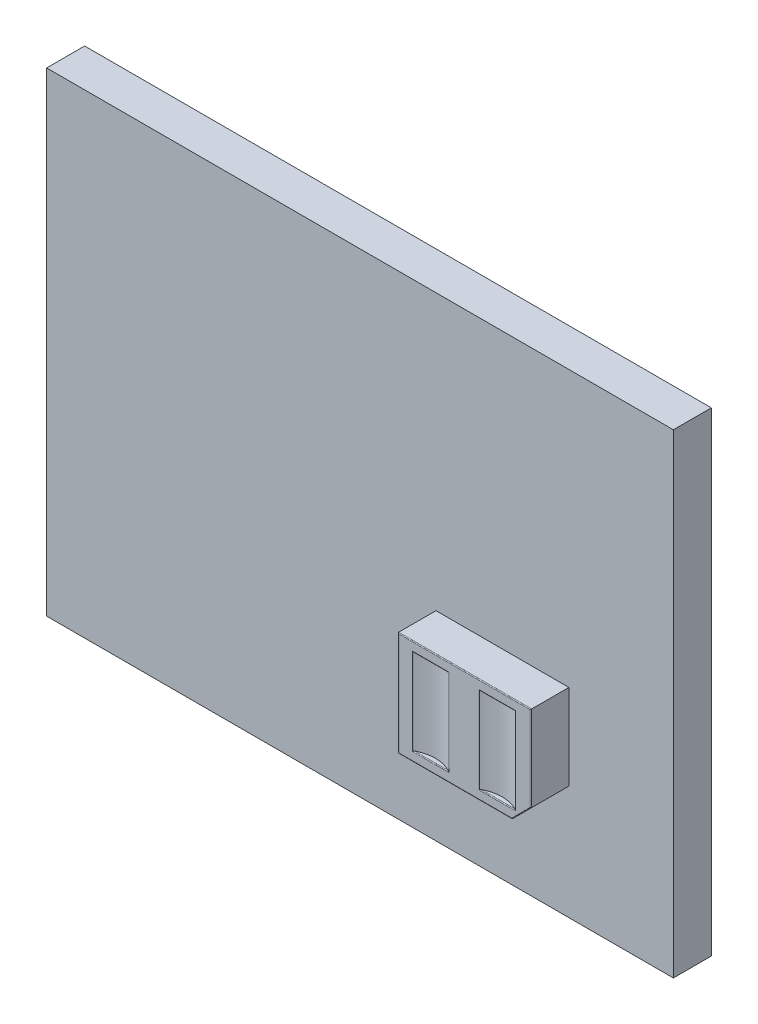
ISO-10303-21;
HEADER;
FILE_DESCRIPTION(('STEP AP214'),'2;1');
FILE_NAME('part.step','',(''),(''),'','','');
FILE_SCHEMA(('AUTOMOTIVE_DESIGN { 1 0 10303 214 1 1 1 1 }'));
ENDSEC;
DATA;
#1=APPLICATION_CONTEXT('core data for automotive mechanical design processes');
#2=APPLICATION_PROTOCOL_DEFINITION('international standard','automotive_design',2000,#1);
#3=PRODUCT_CONTEXT('',#1,'mechanical');
#4=PRODUCT('Part','Part','',(#3));
#5=PRODUCT_RELATED_PRODUCT_CATEGORY('part','',(#4));
#6=PRODUCT_DEFINITION_FORMATION('','',#4);
#7=PRODUCT_DEFINITION_CONTEXT('part definition',#1,'design');
#8=PRODUCT_DEFINITION('design','',#6,#7);
#9=PRODUCT_DEFINITION_SHAPE('','',#8);
#10=(LENGTH_UNIT() NAMED_UNIT(*) SI_UNIT(.MILLI.,.METRE.));
#11=(NAMED_UNIT(*) PLANE_ANGLE_UNIT() SI_UNIT($,.RADIAN.));
#12=(NAMED_UNIT(*) SI_UNIT($,.STERADIAN.) SOLID_ANGLE_UNIT());
#13=UNCERTAINTY_MEASURE_WITH_UNIT(LENGTH_MEASURE(1.E-05),#10,'distance_accuracy_value','');
#14=(GEOMETRIC_REPRESENTATION_CONTEXT(3) GLOBAL_UNCERTAINTY_ASSIGNED_CONTEXT((#13)) GLOBAL_UNIT_ASSIGNED_CONTEXT((#10,
#11,#12)) REPRESENTATION_CONTEXT('',''));
#15=CARTESIAN_POINT('',(0.,0.,0.));
#16=DIRECTION('',(0.,0.,1.));
#17=DIRECTION('',(1.,0.,0.));
#18=AXIS2_PLACEMENT_3D('',#15,#16,#17);
#19=CARTESIAN_POINT('',(2.,-3.75,2.));
#20=DIRECTION('',(0.,0.,1.));
#21=DIRECTION('',(1.,0.,0.));
#22=AXIS2_PLACEMENT_3D('',#19,#20,#21);
#23=PLANE('',#22);
#24=DIRECTION('',(0.,1.,0.));
#25=VECTOR('',#24,1.);
#26=CARTESIAN_POINT('',(3.34009759887177,-3.5,2.));
#27=LINE('',#26,#25);
#28=CARTESIAN_POINT('',(3.34009759887177,-1.23,2.));
#29=VERTEX_POINT('',#28);
#30=CARTESIAN_POINT('',(3.34009759887177,-3.52,2.));
#31=VERTEX_POINT('',#30);
#32=EDGE_CURVE('E281',#29,#31,#27,.F.);
#33=ORIENTED_EDGE('',*,*,#32,.T.);
#34=DIRECTION('',(-1.,0.,0.));
#35=VECTOR('',#34,1.);
#36=CARTESIAN_POINT('',(2.38457281901921,-3.52,2.));
#37=LINE('',#36,#35);
#38=CARTESIAN_POINT('',(2.37925145808885,-3.52,2.));
#39=VERTEX_POINT('',#38);
#40=EDGE_CURVE('E283',#31,#39,#37,.T.);
#41=ORIENTED_EDGE('',*,*,#40,.T.);
#42=DIRECTION('',(0.,1.,0.));
#43=VECTOR('',#42,1.);
#44=CARTESIAN_POINT('',(2.37925145808885,-1.25,2.));
#45=LINE('',#44,#43);
#46=CARTESIAN_POINT('',(2.37925145808885,-1.23,2.));
#47=VERTEX_POINT('',#46);
#48=EDGE_CURVE('E277',#39,#47,#45,.T.);
#49=ORIENTED_EDGE('',*,*,#48,.T.);
#50=DIRECTION('',(-1.,0.,0.));
#51=VECTOR('',#50,1.);
#52=CARTESIAN_POINT('',(2.,-1.23,2.));
#53=LINE('',#52,#51);
#54=EDGE_CURVE('E279',#47,#29,#53,.F.);
#55=ORIENTED_EDGE('',*,*,#54,.T.);
#56=EDGE_LOOP('',(#33,#41,#49,#55));
#57=FACE_BOUND('',#56,.T.);
#58=DIRECTION('',(0.,1.,0.));
#59=VECTOR('',#58,1.);
#60=CARTESIAN_POINT('',(5.48,-1.,2.));
#61=LINE('',#60,#59);
#62=CARTESIAN_POINT('',(5.48,-3.24171572875254,2.));
#63=VERTEX_POINT('',#62);
#64=CARTESIAN_POINT('',(5.48,-1.02,2.));
#65=VERTEX_POINT('',#64);
#66=EDGE_CURVE('E272',#63,#65,#61,.T.);
#67=ORIENTED_EDGE('',*,*,#66,.T.);
#68=DIRECTION('',(-1.,0.,0.));
#69=VECTOR('',#68,1.);
#70=CARTESIAN_POINT('',(2.,-1.02,2.));
#71=LINE('',#70,#69);
#72=CARTESIAN_POINT('',(2.02,-1.02,2.));
#73=VERTEX_POINT('',#72);
#74=EDGE_CURVE('E274',#65,#73,#71,.T.);
#75=ORIENTED_EDGE('',*,*,#74,.T.);
#76=DIRECTION('',(0.,-1.,0.));
#77=VECTOR('',#76,1.);
#78=CARTESIAN_POINT('',(2.02,-3.75,2.));
#79=LINE('',#78,#77);
#80=CARTESIAN_POINT('',(2.02,-3.73,2.));
#81=VERTEX_POINT('',#80);
#82=EDGE_CURVE('E266',#73,#81,#79,.T.);
#83=ORIENTED_EDGE('',*,*,#82,.T.);
#84=DIRECTION('',(1.,0.,0.));
#85=VECTOR('',#84,1.);
#86=CARTESIAN_POINT('',(5.,-3.73,2.));
#87=LINE('',#86,#85);
#88=CARTESIAN_POINT('',(4.99171572875254,-3.73,2.));
#89=VERTEX_POINT('',#88);
#90=EDGE_CURVE('E268',#81,#89,#87,.T.);
#91=ORIENTED_EDGE('',*,*,#90,.T.);
#92=DIRECTION('',(0.707106781186547,0.707106781186548,0.));
#93=VECTOR('',#92,1.);
#94=CARTESIAN_POINT('',(5.48585786437627,-3.23585786437627,2.));
#95=LINE('',#94,#93);
#96=EDGE_CURVE('E270',#89,#63,#95,.T.);
#97=ORIENTED_EDGE('',*,*,#96,.T.);
#98=EDGE_LOOP('',(#67,#75,#83,#91,#97));
#99=FACE_BOUND('',#98,.T.);
#100=DIRECTION('',(-1.,0.,0.));
#101=VECTOR('',#100,1.);
#102=CARTESIAN_POINT('',(2.,-3.52,2.));
#103=LINE('',#102,#101);
#104=CARTESIAN_POINT('',(5.09752708047499,-3.52,2.));
#105=VERTEX_POINT('',#104);
#106=CARTESIAN_POINT('',(4.13668093969207,-3.52,2.));
#107=VERTEX_POINT('',#106);
#108=EDGE_CURVE('E261',#105,#107,#103,.T.);
#109=ORIENTED_EDGE('',*,*,#108,.T.);
#110=DIRECTION('',(0.,1.,0.));
#111=VECTOR('',#110,1.);
#112=CARTESIAN_POINT('',(4.13668093969207,-1.25,2.));
#113=LINE('',#112,#111);
#114=CARTESIAN_POINT('',(4.13668093969207,-1.23,2.));
#115=VERTEX_POINT('',#114);
#116=EDGE_CURVE('E263',#107,#115,#113,.T.);
#117=ORIENTED_EDGE('',*,*,#116,.T.);
#118=DIRECTION('',(-1.,0.,0.));
#119=VECTOR('',#118,1.);
#120=CARTESIAN_POINT('',(5.09220571954463,-1.23,2.));
#121=LINE('',#120,#119);
#122=CARTESIAN_POINT('',(5.09752708047499,-1.23,2.));
#123=VERTEX_POINT('',#122);
#124=EDGE_CURVE('E257',#115,#123,#121,.F.);
#125=ORIENTED_EDGE('',*,*,#124,.T.);
#126=DIRECTION('',(0.,1.,0.));
#127=VECTOR('',#126,1.);
#128=CARTESIAN_POINT('',(5.09752708047499,-3.5,2.));
#129=LINE('',#128,#127);
#130=EDGE_CURVE('E259',#123,#105,#129,.F.);
#131=ORIENTED_EDGE('',*,*,#130,.T.);
#132=EDGE_LOOP('',(#109,#117,#125,#131));
#133=FACE_BOUND('',#132,.T.);
#134=ADVANCED_FACE('F33',(#57,#99,#133),#23,.T.);
#135=CARTESIAN_POINT('',(-8.25,-6.25,1.));
#136=DIRECTION('',(0.,0.,1.));
#137=DIRECTION('',(1.,0.,0.));
#138=AXIS2_PLACEMENT_3D('',#135,#136,#137);
#139=PLANE('',#138);
#140=DIRECTION('',(0.,-1.,0.));
#141=VECTOR('',#140,1.);
#142=CARTESIAN_POINT('',(-8.25,6.25,1.));
#143=LINE('',#142,#141);
#144=CARTESIAN_POINT('',(-8.25,6.25,1.));
#145=VERTEX_POINT('',#144);
#146=CARTESIAN_POINT('',(-8.25,-6.25,1.));
#147=VERTEX_POINT('',#146);
#148=EDGE_CURVE('E236',#145,#147,#143,.T.);
#149=ORIENTED_EDGE('',*,*,#148,.T.);
#150=DIRECTION('',(1.,0.,0.));
#151=VECTOR('',#150,1.);
#152=CARTESIAN_POINT('',(-8.25,-6.25,1.));
#153=LINE('',#152,#151);
#154=CARTESIAN_POINT('',(8.25,-6.25,1.));
#155=VERTEX_POINT('',#154);
#156=EDGE_CURVE('E239',#147,#155,#153,.T.);
#157=ORIENTED_EDGE('',*,*,#156,.T.);
#158=DIRECTION('',(0.,1.,0.));
#159=VECTOR('',#158,1.);
#160=CARTESIAN_POINT('',(8.25,6.25,1.));
#161=LINE('',#160,#159);
#162=CARTESIAN_POINT('',(8.25,6.25,1.));
#163=VERTEX_POINT('',#162);
#164=EDGE_CURVE('E241',#155,#163,#161,.T.);
#165=ORIENTED_EDGE('',*,*,#164,.T.);
#166=DIRECTION('',(-1.,0.,0.));
#167=VECTOR('',#166,1.);
#168=CARTESIAN_POINT('',(-8.25,6.25,1.));
#169=LINE('',#168,#167);
#170=EDGE_CURVE('E243',#163,#145,#169,.T.);
#171=ORIENTED_EDGE('',*,*,#170,.T.);
#172=EDGE_LOOP('',(#149,#157,#165,#171));
#173=FACE_BOUND('',#172,.T.);
#174=DIRECTION('',(-1.,0.,0.));
#175=VECTOR('',#174,1.);
#176=CARTESIAN_POINT('',(-8.25,-3.75,1.));
#177=LINE('',#176,#175);
#178=CARTESIAN_POINT('',(5.,-3.75,1.));
#179=VERTEX_POINT('',#178);
#180=CARTESIAN_POINT('',(2.,-3.75,1.));
#181=VERTEX_POINT('',#180);
#182=EDGE_CURVE('E221',#179,#181,#177,.T.);
#183=ORIENTED_EDGE('',*,*,#182,.T.);
#184=DIRECTION('',(0.,1.,0.));
#185=VECTOR('',#184,1.);
#186=CARTESIAN_POINT('',(2.,-6.25,1.));
#187=LINE('',#186,#185);
#188=CARTESIAN_POINT('',(2.,-1.,1.));
#189=VERTEX_POINT('',#188);
#190=EDGE_CURVE('E198',#181,#189,#187,.T.);
#191=ORIENTED_EDGE('',*,*,#190,.T.);
#192=DIRECTION('',(1.,0.,0.));
#193=VECTOR('',#192,1.);
#194=CARTESIAN_POINT('',(-8.25,-1.,1.));
#195=LINE('',#194,#193);
#196=CARTESIAN_POINT('',(5.5,-1.,1.));
#197=VERTEX_POINT('',#196);
#198=EDGE_CURVE('E209',#189,#197,#195,.T.);
#199=ORIENTED_EDGE('',*,*,#198,.T.);
#200=DIRECTION('',(0.,-1.,0.));
#201=VECTOR('',#200,1.);
#202=CARTESIAN_POINT('',(5.5,-6.25,1.));
#203=LINE('',#202,#201);
#204=CARTESIAN_POINT('',(5.5,-3.25,1.));
#205=VERTEX_POINT('',#204);
#206=EDGE_CURVE('E215',#197,#205,#203,.T.);
#207=ORIENTED_EDGE('',*,*,#206,.T.);
#208=DIRECTION('',(-0.707106781186547,-0.707106781186548,0.));
#209=VECTOR('',#208,1.);
#210=CARTESIAN_POINT('',(-2.87499999999998,-11.625,1.));
#211=LINE('',#210,#209);
#212=EDGE_CURVE('E227',#205,#179,#211,.T.);
#213=ORIENTED_EDGE('',*,*,#212,.T.);
#214=EDGE_LOOP('',(#183,#191,#199,#207,#213));
#215=FACE_BOUND('',#214,.T.);
#216=ADVANCED_FACE('F218',(#173,#215),#139,.T.);
#217=CARTESIAN_POINT('',(-8.25,6.25,1.));
#218=DIRECTION('',(1.,0.,0.));
#219=DIRECTION('',(0.,0.,-1.));
#220=AXIS2_PLACEMENT_3D('',#217,#218,#219);
#221=PLANE('',#220);
#222=DIRECTION('',(0.,-1.,0.));
#223=VECTOR('',#222,1.);
#224=CARTESIAN_POINT('',(-8.25,6.25,0.));
#225=LINE('',#224,#223);
#226=CARTESIAN_POINT('',(-8.25,6.25,0.));
#227=VERTEX_POINT('',#226);
#228=CARTESIAN_POINT('',(-8.25,-6.25,0.));
#229=VERTEX_POINT('',#228);
#230=EDGE_CURVE('E222',#227,#229,#225,.T.);
#231=ORIENTED_EDGE('',*,*,#230,.T.);
#232=DIRECTION('',(0.,0.,-1.));
#233=VECTOR('',#232,1.);
#234=CARTESIAN_POINT('',(-8.25,-6.25,1.));
#235=LINE('',#234,#233);
#236=EDGE_CURVE('E254',#147,#229,#235,.T.);
#237=ORIENTED_EDGE('',*,*,#236,.F.);
#238=ORIENTED_EDGE('',*,*,#148,.F.);
#239=DIRECTION('',(0.,0.,-1.));
#240=VECTOR('',#239,1.);
#241=CARTESIAN_POINT('',(-8.25,6.25,1.));
#242=LINE('',#241,#240);
#243=EDGE_CURVE('E245',#145,#227,#242,.T.);
#244=ORIENTED_EDGE('',*,*,#243,.T.);
#245=EDGE_LOOP('',(#231,#237,#238,#244));
#246=FACE_BOUND('',#245,.T.);
#247=ADVANCED_FACE('F35',(#246),#221,.F.);
#248=CARTESIAN_POINT('',(-8.25,-6.25,1.));
#249=DIRECTION('',(0.,1.,0.));
#250=DIRECTION('',(0.,0.,1.));
#251=AXIS2_PLACEMENT_3D('',#248,#249,#250);
#252=PLANE('',#251);
#253=DIRECTION('',(1.,0.,0.));
#254=VECTOR('',#253,1.);
#255=CARTESIAN_POINT('',(-8.25,-6.25,0.));
#256=LINE('',#255,#254);
#257=CARTESIAN_POINT('',(8.25,-6.25,0.));
#258=VERTEX_POINT('',#257);
#259=EDGE_CURVE('E225',#229,#258,#256,.T.);
#260=ORIENTED_EDGE('',*,*,#259,.T.);
#261=DIRECTION('',(0.,0.,-1.));
#262=VECTOR('',#261,1.);
#263=CARTESIAN_POINT('',(8.25,-6.25,1.));
#264=LINE('',#263,#262);
#265=EDGE_CURVE('E251',#155,#258,#264,.T.);
#266=ORIENTED_EDGE('',*,*,#265,.F.);
#267=ORIENTED_EDGE('',*,*,#156,.F.);
#268=ORIENTED_EDGE('',*,*,#236,.T.);
#269=EDGE_LOOP('',(#260,#266,#267,#268));
#270=FACE_BOUND('',#269,.T.);
#271=ADVANCED_FACE('F665',(#270),#252,.F.);
#272=CARTESIAN_POINT('',(8.25,6.25,1.));
#273=DIRECTION('',(-1.,0.,0.));
#274=DIRECTION('',(0.,0.,1.));
#275=AXIS2_PLACEMENT_3D('',#272,#273,#274);
#276=PLANE('',#275);
#277=DIRECTION('',(0.,1.,0.));
#278=VECTOR('',#277,1.);
#279=CARTESIAN_POINT('',(8.25,6.25,0.));
#280=LINE('',#279,#278);
#281=CARTESIAN_POINT('',(8.25,6.25,0.));
#282=VERTEX_POINT('',#281);
#283=EDGE_CURVE('E232',#258,#282,#280,.T.);
#284=ORIENTED_EDGE('',*,*,#283,.T.);
#285=DIRECTION('',(0.,0.,-1.));
#286=VECTOR('',#285,1.);
#287=CARTESIAN_POINT('',(8.25,6.25,1.));
#288=LINE('',#287,#286);
#289=EDGE_CURVE('E248',#163,#282,#288,.T.);
#290=ORIENTED_EDGE('',*,*,#289,.F.);
#291=ORIENTED_EDGE('',*,*,#164,.F.);
#292=ORIENTED_EDGE('',*,*,#265,.T.);
#293=EDGE_LOOP('',(#284,#290,#291,#292));
#294=FACE_BOUND('',#293,.T.);
#295=ADVANCED_FACE('F655',(#294),#276,.F.);
#296=CARTESIAN_POINT('',(-8.25,6.25,1.));
#297=DIRECTION('',(0.,-1.,0.));
#298=DIRECTION('',(0.,0.,-1.));
#299=AXIS2_PLACEMENT_3D('',#296,#297,#298);
#300=PLANE('',#299);
#301=DIRECTION('',(-1.,0.,0.));
#302=VECTOR('',#301,1.);
#303=CARTESIAN_POINT('',(-8.25,6.25,0.));
#304=LINE('',#303,#302);
#305=EDGE_CURVE('E234',#282,#227,#304,.T.);
#306=ORIENTED_EDGE('',*,*,#305,.T.);
#307=ORIENTED_EDGE('',*,*,#243,.F.);
#308=ORIENTED_EDGE('',*,*,#170,.F.);
#309=ORIENTED_EDGE('',*,*,#289,.T.);
#310=EDGE_LOOP('',(#306,#307,#308,#309));
#311=FACE_BOUND('',#310,.T.);
#312=ADVANCED_FACE('F637',(#311),#300,.F.);
#313=CARTESIAN_POINT('',(-8.25,-6.25,0.));
#314=DIRECTION('',(0.,0.,1.));
#315=DIRECTION('',(1.,0.,0.));
#316=AXIS2_PLACEMENT_3D('',#313,#314,#315);
#317=PLANE('',#316);
#318=ORIENTED_EDGE('',*,*,#230,.F.);
#319=ORIENTED_EDGE('',*,*,#305,.F.);
#320=ORIENTED_EDGE('',*,*,#283,.F.);
#321=ORIENTED_EDGE('',*,*,#259,.F.);
#322=EDGE_LOOP('',(#318,#319,#320,#321));
#323=FACE_BOUND('',#322,.T.);
#324=ADVANCED_FACE('F621',(#323),#317,.F.);
#325=CARTESIAN_POINT('',(2.,-3.75,2.));
#326=DIRECTION('',(1.,0.,0.));
#327=DIRECTION('',(0.,1.,0.));
#328=AXIS2_PLACEMENT_3D('',#325,#326,#327);
#329=PLANE('',#328);
#330=DIRECTION('',(0.,0.,-1.));
#331=VECTOR('',#330,1.);
#332=CARTESIAN_POINT('',(2.,-3.75,2.));
#333=LINE('',#332,#331);
#334=CARTESIAN_POINT('',(2.,-3.75,1.98));
#335=VERTEX_POINT('',#334);
#336=EDGE_CURVE('E216',#335,#181,#333,.T.);
#337=ORIENTED_EDGE('',*,*,#336,.F.);
#338=DIRECTION('',(0.,-1.,0.));
#339=VECTOR('',#338,1.);
#340=CARTESIAN_POINT('',(2.,-1.,1.98));
#341=LINE('',#340,#339);
#342=CARTESIAN_POINT('',(2.,-1.,1.98));
#343=VERTEX_POINT('',#342);
#344=EDGE_CURVE('E201',#335,#343,#341,.F.);
#345=ORIENTED_EDGE('',*,*,#344,.T.);
#346=DIRECTION('',(0.,0.,-1.));
#347=VECTOR('',#346,1.);
#348=CARTESIAN_POINT('',(2.,-1.,2.));
#349=LINE('',#348,#347);
#350=EDGE_CURVE('E193',#343,#189,#349,.T.);
#351=ORIENTED_EDGE('',*,*,#350,.T.);
#352=ORIENTED_EDGE('',*,*,#190,.F.);
#353=EDGE_LOOP('',(#337,#345,#351,#352));
#354=FACE_BOUND('',#353,.T.);
#355=ADVANCED_FACE('F196',(#354),#329,.F.);
#356=CARTESIAN_POINT('',(5.,-3.75,2.));
#357=DIRECTION('',(0.,1.,0.));
#358=DIRECTION('',(-1.,0.,0.));
#359=AXIS2_PLACEMENT_3D('',#356,#357,#358);
#360=PLANE('',#359);
#361=DIRECTION('',(0.,0.,-1.));
#362=VECTOR('',#361,1.);
#363=CARTESIAN_POINT('',(5.,-3.75,2.));
#364=LINE('',#363,#362);
#365=CARTESIAN_POINT('',(5.,-3.75,1.98));
#366=VERTEX_POINT('',#365);
#367=EDGE_CURVE('E452',#366,#179,#364,.T.);
#368=ORIENTED_EDGE('',*,*,#367,.F.);
#369=DIRECTION('',(1.,0.,0.));
#370=VECTOR('',#369,1.);
#371=CARTESIAN_POINT('',(2.,-3.75,1.98));
#372=LINE('',#371,#370);
#373=EDGE_CURVE('E301',#366,#335,#372,.F.);
#374=ORIENTED_EDGE('',*,*,#373,.T.);
#375=ORIENTED_EDGE('',*,*,#336,.T.);
#376=ORIENTED_EDGE('',*,*,#182,.F.);
#377=EDGE_LOOP('',(#368,#374,#375,#376));
#378=FACE_BOUND('',#377,.T.);
#379=ADVANCED_FACE('F463',(#378),#360,.F.);
#380=CARTESIAN_POINT('',(5.5,-3.25,2.));
#381=DIRECTION('',(-0.707106781186548,0.707106781186547,0.));
#382=DIRECTION('',(-0.707106781186547,-0.707106781186548,0.));
#383=AXIS2_PLACEMENT_3D('',#380,#381,#382);
#384=PLANE('',#383);
#385=DIRECTION('',(0.,0.,-1.));
#386=VECTOR('',#385,1.);
#387=CARTESIAN_POINT('',(5.5,-3.25,2.));
#388=LINE('',#387,#386);
#389=CARTESIAN_POINT('',(5.5,-3.25,1.98));
#390=VERTEX_POINT('',#389);
#391=EDGE_CURVE('E450',#390,#205,#388,.T.);
#392=ORIENTED_EDGE('',*,*,#391,.F.);
#393=DIRECTION('',(0.707106781186547,0.707106781186548,0.));
#394=VECTOR('',#393,1.);
#395=CARTESIAN_POINT('',(5.,-3.75,1.98));
#396=LINE('',#395,#394);
#397=EDGE_CURVE('E299',#390,#366,#396,.F.);
#398=ORIENTED_EDGE('',*,*,#397,.T.);
#399=ORIENTED_EDGE('',*,*,#367,.T.);
#400=ORIENTED_EDGE('',*,*,#212,.F.);
#401=EDGE_LOOP('',(#392,#398,#399,#400));
#402=FACE_BOUND('',#401,.T.);
#403=ADVANCED_FACE('F458',(#402),#384,.F.);
#404=CARTESIAN_POINT('',(5.5,-1.,2.));
#405=DIRECTION('',(-1.,0.,0.));
#406=DIRECTION('',(0.,0.,1.));
#407=AXIS2_PLACEMENT_3D('',#404,#405,#406);
#408=PLANE('',#407);
#409=DIRECTION('',(0.,0.,-1.));
#410=VECTOR('',#409,1.);
#411=CARTESIAN_POINT('',(5.5,-1.,2.));
#412=LINE('',#411,#410);
#413=CARTESIAN_POINT('',(5.5,-1.,1.98));
#414=VERTEX_POINT('',#413);
#415=EDGE_CURVE('E205',#414,#197,#412,.T.);
#416=ORIENTED_EDGE('',*,*,#415,.F.);
#417=DIRECTION('',(0.,1.,0.));
#418=VECTOR('',#417,1.);
#419=CARTESIAN_POINT('',(5.5,-3.25,1.98));
#420=LINE('',#419,#418);
#421=EDGE_CURVE('E297',#414,#390,#420,.F.);
#422=ORIENTED_EDGE('',*,*,#421,.T.);
#423=ORIENTED_EDGE('',*,*,#391,.T.);
#424=ORIENTED_EDGE('',*,*,#206,.F.);
#425=EDGE_LOOP('',(#416,#422,#423,#424));
#426=FACE_BOUND('',#425,.T.);
#427=ADVANCED_FACE('F479',(#426),#408,.F.);
#428=CARTESIAN_POINT('',(2.,-1.,2.));
#429=DIRECTION('',(0.,-1.,0.));
#430=DIRECTION('',(0.,0.,-1.));
#431=AXIS2_PLACEMENT_3D('',#428,#429,#430);
#432=PLANE('',#431);
#433=ORIENTED_EDGE('',*,*,#350,.F.);
#434=DIRECTION('',(-1.,0.,0.));
#435=VECTOR('',#434,1.);
#436=CARTESIAN_POINT('',(5.5,-1.,1.98));
#437=LINE('',#436,#435);
#438=EDGE_CURVE('E295',#343,#414,#437,.F.);
#439=ORIENTED_EDGE('',*,*,#438,.T.);
#440=ORIENTED_EDGE('',*,*,#415,.T.);
#441=ORIENTED_EDGE('',*,*,#198,.F.);
#442=EDGE_LOOP('',(#433,#439,#440,#441));
#443=FACE_BOUND('',#442,.T.);
#444=ADVANCED_FACE('F210',(#443),#432,.F.);
#445=CARTESIAN_POINT('',(2.85967452848031,-1.25,2.82428912257081));
#446=DIRECTION('',(0.,-1.,0.));
#447=DIRECTION('',(0.,0.,-1.));
#448=AXIS2_PLACEMENT_3D('',#445,#446,#447);
#449=CYLINDRICAL_SURFACE('',#448,0.95140642835826);
#450=CARTESIAN_POINT('',(3.29825185282578,-3.5,1.98));
#451=CARTESIAN_POINT('',(3.30030143263974,-3.50000121839168,1.98106471582591));
#452=CARTESIAN_POINT('',(3.30234482766277,-3.50008460776287,1.98213566956922));
#453=CARTESIAN_POINT('',(3.30642373641544,-3.5004352465639,1.9842922526646));
#454=CARTESIAN_POINT('',(3.30845912580693,-3.50070361570461,1.98537793169879));
#455=CARTESIAN_POINT('',(3.31432945041123,-3.5017791143004,1.98853680792534));
#456=CARTESIAN_POINT('',(3.31812678666193,-3.50285399691591,1.99061495007289));
#457=CARTESIAN_POINT('',(3.32324263650945,-3.50516501582656,1.99345711157462));
#458=CARTESIAN_POINT('',(3.32472361069494,-3.50594762114878,1.99428546911798));
#459=CARTESIAN_POINT('',(3.3275757839046,-3.50779498116049,1.99588979719535));
#460=CARTESIAN_POINT('',(3.32894432307832,-3.50886487402507,1.99666445338982));
#461=CARTESIAN_POINT('',(3.33020631019211,-3.51010871132026,1.9973828193414));
#462=B_SPLINE_CURVE_WITH_KNOTS('',3,(#450,#451,#452,#453,#454,#455,#456,#457,#458,#459,#460,
#461),.UNSPECIFIED.,.F.,.F.,(4,2,2,2,2,4),(0.,0.00692143937361541,0.0138851475056122,
0.027147880605819,0.0327331858915279,0.0384259374750013),.UNSPECIFIED.);
#463=CARTESIAN_POINT('',(3.29825185282578,-3.5,1.98));
#464=VERTEX_POINT('',#463);
#465=CARTESIAN_POINT('',(3.33020631019246,-3.51010871131924,1.9973828193416));
#466=VERTEX_POINT('',#465);
#467=EDGE_CURVE('E318',#464,#466,#462,.T.);
#468=ORIENTED_EDGE('',*,*,#467,.T.);
#469=DIRECTION('',(0.,-1.,0.));
#470=VECTOR('',#469,1.);
#471=CARTESIAN_POINT('',(3.33020631019246,-1.25,1.9973828193416));
#472=LINE('',#471,#470);
#473=CARTESIAN_POINT('',(3.33020631019246,-1.23989128868076,1.9973828193416));
#474=VERTEX_POINT('',#473);
#475=EDGE_CURVE('E291',#466,#474,#472,.F.);
#476=ORIENTED_EDGE('',*,*,#475,.T.);
#477=CARTESIAN_POINT('',(3.33020631019246,-1.23989128868076,1.9973828193416));
#478=CARTESIAN_POINT('',(3.32907457056046,-1.24101003683441,1.99673862227858));
#479=CARTESIAN_POINT('',(3.32785338435945,-1.24198753053109,1.99604700264423));
#480=CARTESIAN_POINT('',(3.32530170338301,-1.24370587720741,1.99460993356394));
#481=CARTESIAN_POINT('',(3.32397241183,-1.24444897937049,1.99386508551638));
#482=CARTESIAN_POINT('',(3.32006330504253,-1.24633742044261,1.99168783877315));
#483=CARTESIAN_POINT('',(3.31740293921396,-1.24726919187549,1.99022177053134));
#484=CARTESIAN_POINT('',(3.31196357324895,-1.24870863437455,1.98725952948016));
#485=CARTESIAN_POINT('',(3.30918374060652,-1.24921253457698,1.98576320561733));
#486=CARTESIAN_POINT('',(3.30502790468668,-1.24969551509605,1.98355318171556));
#487=CARTESIAN_POINT('',(3.3036687385853,-1.24981123923966,1.98283460719886));
#488=CARTESIAN_POINT('',(3.30095755661327,-1.24996295288859,1.98140965105981));
#489=CARTESIAN_POINT('',(3.29960561255512,-1.24999975606144,1.98070322024471));
#490=CARTESIAN_POINT('',(3.29825185282578,-1.25,1.98));
#491=B_SPLINE_CURVE_WITH_KNOTS('',3,(#477,#478,#479,#480,#481,#482,#483,#484,#485,#486,#487,
#488,#489,#490),.UNSPECIFIED.,.F.,.F.,(4,2,2,2,2,2,4),(0.,0.00511946838208151,
0.0101882011420187,0.0196727538814233,0.0292400519423795,0.033863671938869,0.038439389001407),.UNSPECIFIED.);
#492=CARTESIAN_POINT('',(3.29825185282578,-1.25,1.98));
#493=VERTEX_POINT('',#492);
#494=EDGE_CURVE('E357',#474,#493,#491,.T.);
#495=ORIENTED_EDGE('',*,*,#494,.T.);
#496=CARTESIAN_POINT('',(2.85967452848031,-1.25,2.82428912257081));
#497=DIRECTION('',(0.,-1.,0.));
#498=DIRECTION('',(0.,0.,-1.));
#499=AXIS2_PLACEMENT_3D('',#496,#497,#498);
#500=CIRCLE('',#499,0.95140642835826);
#501=CARTESIAN_POINT('',(2.42109720413484,-1.25,1.98));
#502=VERTEX_POINT('',#501);
#503=EDGE_CURVE('E206',#502,#493,#500,.T.);
#504=ORIENTED_EDGE('',*,*,#503,.F.);
#505=CARTESIAN_POINT('',(2.42109720413517,-1.25,1.97999999999983));
#506=CARTESIAN_POINT('',(2.41904762432119,-1.24999878160833,1.98106471582575));
#507=CARTESIAN_POINT('',(2.41700422929815,-1.24991539223715,1.98213566956907));
#508=CARTESIAN_POINT('',(2.41292532054544,-1.24956475343614,1.98429225266446));
#509=CARTESIAN_POINT('',(2.41088993115393,-1.24929638429543,1.98537793169866));
#510=CARTESIAN_POINT('',(2.40501960654959,-1.24822088569966,1.98853680792524));
#511=CARTESIAN_POINT('',(2.40122227029885,-1.24714600308415,1.9906149500728));
#512=CARTESIAN_POINT('',(2.39610642045128,-1.2448349841735,1.99345711157455));
#513=CARTESIAN_POINT('',(2.39462544626576,-1.24405237885127,1.99428546911793));
#514=CARTESIAN_POINT('',(2.39177327305606,-1.24220501883954,1.99588979719533));
#515=CARTESIAN_POINT('',(2.39040473388232,-1.24113512597495,1.99666445338981));
#516=CARTESIAN_POINT('',(2.38914274676851,-1.23989128867974,1.9973828193414));
#517=B_SPLINE_CURVE_WITH_KNOTS('',3,(#505,#506,#507,#508,#509,#510,#511,#512,#513,#514,#515,
#516),.UNSPECIFIED.,.F.,.F.,(4,2,2,2,2,4),(0.,0.00692143937366663,0.0138851475057146,
0.0271478806060176,0.0327331858918071,0.0384259374753652),.UNSPECIFIED.);
#518=CARTESIAN_POINT('',(2.38914274676816,-1.23989128868076,1.9973828193416));
#519=VERTEX_POINT('',#518);
#520=EDGE_CURVE('E352',#502,#519,#517,.T.);
#521=ORIENTED_EDGE('',*,*,#520,.T.);
#522=DIRECTION('',(0.,-1.,0.));
#523=VECTOR('',#522,1.);
#524=CARTESIAN_POINT('',(2.38914274676816,-1.25,1.9973828193416));
#525=LINE('',#524,#523);
#526=CARTESIAN_POINT('',(2.38914274676816,-3.51010871131924,1.9973828193416));
#527=VERTEX_POINT('',#526);
#528=EDGE_CURVE('E289',#519,#527,#525,.T.);
#529=ORIENTED_EDGE('',*,*,#528,.T.);
#530=CARTESIAN_POINT('',(2.38914274676816,-3.51010871131924,1.9973828193416));
#531=CARTESIAN_POINT('',(2.39027448640016,-3.5089899631656,1.99673862227858));
#532=CARTESIAN_POINT('',(2.39149567260117,-3.50801246946891,1.99604700264423));
#533=CARTESIAN_POINT('',(2.39404735357761,-3.50629412279259,1.99460993356394));
#534=CARTESIAN_POINT('',(2.39537664513062,-3.50555102062951,1.99386508551638));
#535=CARTESIAN_POINT('',(2.39928575191809,-3.50366257955739,1.99168783877315));
#536=CARTESIAN_POINT('',(2.40194611774665,-3.50273080812452,1.99022177053134));
#537=CARTESIAN_POINT('',(2.40738548371167,-3.50129136562545,1.98725952948016));
#538=CARTESIAN_POINT('',(2.4101653163541,-3.50078746542302,1.98576320561733));
#539=CARTESIAN_POINT('',(2.41432115227413,-3.50030448490393,1.98355318171546));
#540=CARTESIAN_POINT('',(2.41568031837571,-3.50018876076031,1.98283460719865));
#541=CARTESIAN_POINT('',(2.41839150034813,-3.50003704711138,1.98140965105941));
#542=CARTESIAN_POINT('',(2.41974344440647,-3.50000024393855,1.9807032202442));
#543=CARTESIAN_POINT('',(2.42109720413601,-3.5,1.9799999999994));
#544=B_SPLINE_CURVE_WITH_KNOTS('',3,(#530,#531,#532,#533,#534,#535,#536,#537,#538,#539,#540,
#541,#542,#543),.UNSPECIFIED.,.F.,.F.,(4,2,2,2,2,2,4),(0.,0.00511946838208176,
0.0101882011420185,0.0196727538814203,0.0292400519423793,0.0338636719395309,0.0384393890027168),.UNSPECIFIED.);
#545=CARTESIAN_POINT('',(2.42109720413484,-3.5,1.98));
#546=VERTEX_POINT('',#545);
#547=EDGE_CURVE('E311',#527,#546,#544,.T.);
#548=ORIENTED_EDGE('',*,*,#547,.T.);
#549=CARTESIAN_POINT('',(2.85967452848031,-3.5,2.82428912257081));
#550=DIRECTION('',(0.,-1.,0.));
#551=DIRECTION('',(0.,0.,-1.));
#552=AXIS2_PLACEMENT_3D('',#549,#550,#551);
#553=CIRCLE('',#552,0.95140642835826);
#554=EDGE_CURVE('E444',#546,#464,#553,.T.);
#555=ORIENTED_EDGE('',*,*,#554,.T.);
#556=EDGE_LOOP('',(#468,#476,#495,#504,#521,#529,#548,#555));
#557=FACE_BOUND('',#556,.T.);
#558=ADVANCED_FACE('F323',(#557),#449,.F.);
#559=CARTESIAN_POINT('',(2.85967452848031,-1.25,2.82428912257081));
#560=DIRECTION('',(0.,-1.,0.));
#561=DIRECTION('',(0.,0.,-1.));
#562=AXIS2_PLACEMENT_3D('',#559,#560,#561);
#563=PLANE('',#562);
#564=ORIENTED_EDGE('',*,*,#503,.T.);
#565=DIRECTION('',(-1.,0.,0.));
#566=VECTOR('',#565,1.);
#567=CARTESIAN_POINT('',(2.85967452848031,-1.25,1.98));
#568=LINE('',#567,#566);
#569=EDGE_CURVE('E293',#493,#502,#568,.T.);
#570=ORIENTED_EDGE('',*,*,#569,.T.);
#571=EDGE_LOOP('',(#564,#570));
#572=FACE_BOUND('',#571,.T.);
#573=ADVANCED_FACE('F563',(#572),#563,.T.);
#574=CARTESIAN_POINT('',(2.85967452848031,-3.5,2.82428912257081));
#575=DIRECTION('',(0.,-1.,0.));
#576=DIRECTION('',(0.,0.,-1.));
#577=AXIS2_PLACEMENT_3D('',#574,#575,#576);
#578=PLANE('',#577);
#579=ORIENTED_EDGE('',*,*,#554,.F.);
#580=DIRECTION('',(-1.,0.,0.));
#581=VECTOR('',#580,1.);
#582=CARTESIAN_POINT('',(3.33477623794141,-3.5,1.98));
#583=LINE('',#582,#581);
#584=EDGE_CURVE('E286',#546,#464,#583,.F.);
#585=ORIENTED_EDGE('',*,*,#584,.T.);
#586=EDGE_LOOP('',(#579,#585));
#587=FACE_BOUND('',#586,.T.);
#588=ADVANCED_FACE('F505',(#587),#578,.F.);
#589=CARTESIAN_POINT('',(4.61710401008353,-1.25,2.82428912257081));
#590=DIRECTION('',(0.,-1.,0.));
#591=DIRECTION('',(0.,0.,-1.));
#592=AXIS2_PLACEMENT_3D('',#589,#590,#591);
#593=CYLINDRICAL_SURFACE('',#592,0.95140642835826);
#594=CARTESIAN_POINT('',(4.61710401008353,-1.25,2.82428912257081));
#595=DIRECTION('',(0.,-1.,0.));
#596=DIRECTION('',(0.,0.,1.));
#597=AXIS2_PLACEMENT_3D('',#594,#595,#596);
#598=CIRCLE('',#597,0.95140642835826);
#599=CARTESIAN_POINT('',(4.17852668573806,-1.25,1.98));
#600=VERTEX_POINT('',#599);
#601=CARTESIAN_POINT('',(5.05568133442899,-1.25,1.98));
#602=VERTEX_POINT('',#601);
#603=EDGE_CURVE('E441',#600,#602,#598,.T.);
#604=ORIENTED_EDGE('',*,*,#603,.F.);
#605=CARTESIAN_POINT('',(4.17852668573838,-1.25,1.97999999999983));
#606=CARTESIAN_POINT('',(4.17647710592441,-1.24999878160833,1.98106471582575));
#607=CARTESIAN_POINT('',(4.17443371090136,-1.24991539223715,1.98213566956907));
#608=CARTESIAN_POINT('',(4.17035480214865,-1.24956475343614,1.98429225266446));
#609=CARTESIAN_POINT('',(4.16831941275715,-1.24929638429543,1.98537793169867));
#610=CARTESIAN_POINT('',(4.16244908815281,-1.24822088569966,1.98853680792524));
#611=CARTESIAN_POINT('',(4.15865175190207,-1.24714600308415,1.9906149500728));
#612=CARTESIAN_POINT('',(4.1535359020545,-1.2448349841735,1.99345711157455));
#613=CARTESIAN_POINT('',(4.15205492786898,-1.24405237885127,1.99428546911793));
#614=CARTESIAN_POINT('',(4.14920275465927,-1.24220501883954,1.99588979719533));
#615=CARTESIAN_POINT('',(4.14783421548553,-1.24113512597495,1.99666445338981));
#616=CARTESIAN_POINT('',(4.14657222837173,-1.23989128867974,1.9973828193414));
#617=B_SPLINE_CURVE_WITH_KNOTS('',3,(#605,#606,#607,#608,#609,#610,#611,#612,#613,#614,#615,
#616),.UNSPECIFIED.,.F.,.F.,(4,2,2,2,2,4),(0.,0.00692143937366643,0.0138851475057154,
0.0271478806060181,0.0327331858918068,0.038425937475364),.UNSPECIFIED.);
#618=CARTESIAN_POINT('',(4.14657222837138,-1.23989128868076,1.9973828193416));
#619=VERTEX_POINT('',#618);
#620=EDGE_CURVE('E46',#600,#619,#617,.T.);
#621=ORIENTED_EDGE('',*,*,#620,.T.);
#622=DIRECTION('',(0.,-1.,0.));
#623=VECTOR('',#622,1.);
#624=CARTESIAN_POINT('',(4.14657222837138,-1.25,1.9973828193416));
#625=LINE('',#624,#623);
#626=CARTESIAN_POINT('',(4.14657222837138,-3.51010871131924,1.9973828193416));
#627=VERTEX_POINT('',#626);
#628=EDGE_CURVE('E305',#619,#627,#625,.T.);
#629=ORIENTED_EDGE('',*,*,#628,.T.);
#630=CARTESIAN_POINT('',(4.14657222837138,-3.51010871131924,1.9973828193416));
#631=CARTESIAN_POINT('',(4.14770396800338,-3.5089899631656,1.99673862227858));
#632=CARTESIAN_POINT('',(4.14892515420438,-3.50801246946891,1.99604700264423));
#633=CARTESIAN_POINT('',(4.15147683518083,-3.50629412279259,1.99460993356394));
#634=CARTESIAN_POINT('',(4.15280612673384,-3.50555102062951,1.99386508551638));
#635=CARTESIAN_POINT('',(4.15671523352131,-3.50366257955739,1.99168783877315));
#636=CARTESIAN_POINT('',(4.15937559934987,-3.50273080812452,1.99022177053134));
#637=CARTESIAN_POINT('',(4.16481496531489,-3.50129136562545,1.98725952948016));
#638=CARTESIAN_POINT('',(4.16759479795732,-3.50078746542302,1.98576320561733));
#639=CARTESIAN_POINT('',(4.17175063387735,-3.50030448490393,1.98355318171546));
#640=CARTESIAN_POINT('',(4.17310979997893,-3.50018876076031,1.98283460719865));
#641=CARTESIAN_POINT('',(4.17582098195135,-3.50003704711138,1.98140965105941));
#642=CARTESIAN_POINT('',(4.17717292600969,-3.50000024393855,1.9807032202442));
#643=CARTESIAN_POINT('',(4.17852668573922,-3.5,1.9799999999994));
#644=B_SPLINE_CURVE_WITH_KNOTS('',3,(#630,#631,#632,#633,#634,#635,#636,#637,#638,#639,#640,
#641,#642,#643),.UNSPECIFIED.,.F.,.F.,(4,2,2,2,2,2,4),(0.,0.00511946838208199,
0.0101882011420187,0.0196727538814197,0.0292400519423791,0.0338636719395303,0.0384393890027168),.UNSPECIFIED.);
#645=CARTESIAN_POINT('',(4.17852668573806,-3.5,1.98));
#646=VERTEX_POINT('',#645);
#647=EDGE_CURVE('E362',#627,#646,#644,.T.);
#648=ORIENTED_EDGE('',*,*,#647,.T.);
#649=CARTESIAN_POINT('',(4.61710401008353,-3.5,2.82428912257081));
#650=DIRECTION('',(0.,-1.,0.));
#651=DIRECTION('',(0.,0.,1.));
#652=AXIS2_PLACEMENT_3D('',#649,#650,#651);
#653=CIRCLE('',#652,0.95140642835826);
#654=CARTESIAN_POINT('',(5.05568133442899,-3.5,1.98));
#655=VERTEX_POINT('',#654);
#656=EDGE_CURVE('E401',#646,#655,#653,.T.);
#657=ORIENTED_EDGE('',*,*,#656,.T.);
#658=CARTESIAN_POINT('',(5.05568133442899,-3.5,1.98));
#659=CARTESIAN_POINT('',(5.05773091424295,-3.50000121839168,1.98106471582591));
#660=CARTESIAN_POINT('',(5.05977430926598,-3.50008460776287,1.98213566956922));
#661=CARTESIAN_POINT('',(5.06385321801866,-3.5004352465639,1.9842922526646));
#662=CARTESIAN_POINT('',(5.06588860741015,-3.50070361570461,1.9853779316988));
#663=CARTESIAN_POINT('',(5.07175893201444,-3.5017791143004,1.98853680792534));
#664=CARTESIAN_POINT('',(5.07555626826515,-3.50285399691591,1.99061495007289));
#665=CARTESIAN_POINT('',(5.08067211811266,-3.50516501582656,1.99345711157462));
#666=CARTESIAN_POINT('',(5.08215309229816,-3.50594762114878,1.99428546911798));
#667=CARTESIAN_POINT('',(5.08500526550782,-3.50779498116049,1.99588979719535));
#668=CARTESIAN_POINT('',(5.08637380468154,-3.50886487402507,1.99666445338982));
#669=CARTESIAN_POINT('',(5.08763579179533,-3.51010871132026,1.9973828193414));
#670=B_SPLINE_CURVE_WITH_KNOTS('',3,(#658,#659,#660,#661,#662,#663,#664,#665,#666,#667,#668,
#669),.UNSPECIFIED.,.F.,.F.,(4,2,2,2,2,4),(0.,0.00692143937361483,0.0138851475056124,
0.0271478806058188,0.0327331858915274,0.038425937475001),.UNSPECIFIED.);
#671=CARTESIAN_POINT('',(5.08763579179568,-3.51010871131924,1.9973828193416));
#672=VERTEX_POINT('',#671);
#673=EDGE_CURVE('E368',#655,#672,#670,.T.);
#674=ORIENTED_EDGE('',*,*,#673,.T.);
#675=DIRECTION('',(0.,-1.,0.));
#676=VECTOR('',#675,1.);
#677=CARTESIAN_POINT('',(5.08763579179568,-1.25,1.9973828193416));
#678=LINE('',#677,#676);
#679=CARTESIAN_POINT('',(5.08763579179568,-1.23989128868076,1.9973828193416));
#680=VERTEX_POINT('',#679);
#681=EDGE_CURVE('E52',#672,#680,#678,.F.);
#682=ORIENTED_EDGE('',*,*,#681,.T.);
#683=CARTESIAN_POINT('',(5.08763579179568,-1.23989128868076,1.9973828193416));
#684=CARTESIAN_POINT('',(5.08650405216367,-1.24101003683441,1.99673862227858));
#685=CARTESIAN_POINT('',(5.08528286596267,-1.24198753053109,1.99604700264423));
#686=CARTESIAN_POINT('',(5.08273118498623,-1.24370587720741,1.99460993356394));
#687=CARTESIAN_POINT('',(5.08140189343322,-1.24444897937049,1.99386508551638));
#688=CARTESIAN_POINT('',(5.07749278664574,-1.24633742044261,1.99168783877315));
#689=CARTESIAN_POINT('',(5.07483242081718,-1.24726919187549,1.99022177053134));
#690=CARTESIAN_POINT('',(5.06939305485216,-1.24870863437455,1.98725952948016));
#691=CARTESIAN_POINT('',(5.06661322220973,-1.24921253457698,1.98576320561733));
#692=CARTESIAN_POINT('',(5.0624573862899,-1.24969551509605,1.98355318171556));
#693=CARTESIAN_POINT('',(5.06109822018852,-1.24981123923966,1.98283460719886));
#694=CARTESIAN_POINT('',(5.05838703821648,-1.24996295288859,1.98140965105981));
#695=CARTESIAN_POINT('',(5.05703509415834,-1.24999975606144,1.98070322024471));
#696=CARTESIAN_POINT('',(5.05568133442899,-1.25,1.98));
#697=B_SPLINE_CURVE_WITH_KNOTS('',3,(#683,#684,#685,#686,#687,#688,#689,#690,#691,#692,#693,
#694,#695,#696),.UNSPECIFIED.,.F.,.F.,(4,2,2,2,2,2,4),(0.,0.00511946838208138,
0.0101882011420187,0.0196727538814229,0.0292400519423781,0.0338636719388692,0.0384393890014075),.UNSPECIFIED.);
#698=EDGE_CURVE('E11',#680,#602,#697,.T.);
#699=ORIENTED_EDGE('',*,*,#698,.T.);
#700=EDGE_LOOP('',(#604,#621,#629,#648,#657,#674,#682,#699));
#701=FACE_BOUND('',#700,.T.);
#702=ADVANCED_FACE('F372',(#701),#593,.F.);
#703=CARTESIAN_POINT('',(4.61710401008353,-1.25,2.82428912257081));
#704=DIRECTION('',(0.,1.,0.));
#705=DIRECTION('',(0.,0.,1.));
#706=AXIS2_PLACEMENT_3D('',#703,#704,#705);
#707=PLANE('',#706);
#708=ORIENTED_EDGE('',*,*,#603,.T.);
#709=DIRECTION('',(-1.,0.,0.));
#710=VECTOR('',#709,1.);
#711=CARTESIAN_POINT('',(4.14200230062243,-1.25,1.98));
#712=LINE('',#711,#710);
#713=EDGE_CURVE('E309',#602,#600,#712,.T.);
#714=ORIENTED_EDGE('',*,*,#713,.T.);
#715=EDGE_LOOP('',(#708,#714));
#716=FACE_BOUND('',#715,.T.);
#717=ADVANCED_FACE('F497',(#716),#707,.F.);
#718=CARTESIAN_POINT('',(4.61710401008353,-3.5,2.82428912257081));
#719=DIRECTION('',(0.,1.,0.));
#720=DIRECTION('',(0.,0.,1.));
#721=AXIS2_PLACEMENT_3D('',#718,#719,#720);
#722=PLANE('',#721);
#723=ORIENTED_EDGE('',*,*,#656,.F.);
#724=DIRECTION('',(-1.,0.,0.));
#725=VECTOR('',#724,1.);
#726=CARTESIAN_POINT('',(4.61710401008353,-3.5,1.98));
#727=LINE('',#726,#725);
#728=EDGE_CURVE('E307',#646,#655,#727,.F.);
#729=ORIENTED_EDGE('',*,*,#728,.T.);
#730=EDGE_LOOP('',(#723,#729));
#731=FACE_BOUND('',#730,.T.);
#732=ADVANCED_FACE('F348',(#731),#722,.T.);
#733=CARTESIAN_POINT('',(2.85967452848031,-1.23,1.98));
#734=DIRECTION('',(-1.,0.,0.));
#735=DIRECTION('',(0.,0.,1.));
#736=AXIS2_PLACEMENT_3D('',#733,#734,#735);
#737=CYLINDRICAL_SURFACE('',#736,0.02);
#738=ORIENTED_EDGE('',*,*,#569,.F.);
#739=ORIENTED_EDGE('',*,*,#494,.F.);
#740=CARTESIAN_POINT('',(3.34009759887177,-1.23,1.98));
#741=DIRECTION('',(0.707106781186547,-0.707106781186547,0.));
#742=DIRECTION('',(-0.707106781186547,-0.707106781186547,0.));
#743=AXIS2_PLACEMENT_3D('',#740,#741,#742);
#744=ELLIPSE('',#743,0.0282842712474619,0.02);
#745=EDGE_CURVE('E437',#29,#474,#744,.T.);
#746=ORIENTED_EDGE('',*,*,#745,.F.);
#747=ORIENTED_EDGE('',*,*,#54,.F.);
#748=CARTESIAN_POINT('',(2.37925145808885,-1.23,1.98));
#749=DIRECTION('',(-0.707106781186547,-0.707106781186547,0.));
#750=DIRECTION('',(-0.707106781186547,0.707106781186547,0.));
#751=AXIS2_PLACEMENT_3D('',#748,#749,#750);
#752=ELLIPSE('',#751,0.0282842712474619,0.02);
#753=EDGE_CURVE('E434',#519,#47,#752,.T.);
#754=ORIENTED_EDGE('',*,*,#753,.F.);
#755=ORIENTED_EDGE('',*,*,#520,.F.);
#756=EDGE_LOOP('',(#738,#739,#746,#747,#754,#755));
#757=FACE_BOUND('',#756,.T.);
#758=ADVANCED_FACE('F343',(#757),#737,.T.);
#759=CARTESIAN_POINT('',(3.34009759887177,-1.25,1.98));
#760=DIRECTION('',(0.,-1.,0.));
#761=DIRECTION('',(0.,0.,-1.));
#762=AXIS2_PLACEMENT_3D('',#759,#760,#761);
#763=CYLINDRICAL_SURFACE('',#762,0.02);
#764=ORIENTED_EDGE('',*,*,#475,.F.);
#765=CARTESIAN_POINT('',(3.34009759887177,-3.52,1.98));
#766=DIRECTION('',(0.707106781186547,0.707106781186547,0.));
#767=DIRECTION('',(0.707106781186547,-0.707106781186547,0.));
#768=AXIS2_PLACEMENT_3D('',#765,#766,#767);
#769=ELLIPSE('',#768,0.0282842712474619,0.02);
#770=EDGE_CURVE('E431',#31,#466,#769,.F.);
#771=ORIENTED_EDGE('',*,*,#770,.F.);
#772=ORIENTED_EDGE('',*,*,#32,.F.);
#773=ORIENTED_EDGE('',*,*,#745,.T.);
#774=EDGE_LOOP('',(#764,#771,#772,#773));
#775=FACE_BOUND('',#774,.T.);
#776=ADVANCED_FACE('F339',(#775),#763,.T.);
#777=CARTESIAN_POINT('',(2.37925145808885,-1.25,1.98));
#778=DIRECTION('',(0.,-1.,0.));
#779=DIRECTION('',(0.,0.,-1.));
#780=AXIS2_PLACEMENT_3D('',#777,#778,#779);
#781=CYLINDRICAL_SURFACE('',#780,0.02);
#782=ORIENTED_EDGE('',*,*,#753,.T.);
#783=ORIENTED_EDGE('',*,*,#48,.F.);
#784=CARTESIAN_POINT('',(2.37925145808885,-3.52,1.98));
#785=DIRECTION('',(0.707106781186547,-0.707106781186547,0.));
#786=DIRECTION('',(0.707106781186547,0.707106781186547,0.));
#787=AXIS2_PLACEMENT_3D('',#784,#785,#786);
#788=ELLIPSE('',#787,0.0282842712474619,0.02);
#789=EDGE_CURVE('E429',#527,#39,#788,.T.);
#790=ORIENTED_EDGE('',*,*,#789,.F.);
#791=ORIENTED_EDGE('',*,*,#528,.F.);
#792=EDGE_LOOP('',(#782,#783,#790,#791));
#793=FACE_BOUND('',#792,.T.);
#794=ADVANCED_FACE('F333',(#793),#781,.T.);
#795=CARTESIAN_POINT('',(2.,-3.52,1.98));
#796=DIRECTION('',(1.,0.,0.));
#797=DIRECTION('',(0.,0.,-1.));
#798=AXIS2_PLACEMENT_3D('',#795,#796,#797);
#799=CYLINDRICAL_SURFACE('',#798,0.02);
#800=ORIENTED_EDGE('',*,*,#467,.F.);
#801=ORIENTED_EDGE('',*,*,#584,.F.);
#802=ORIENTED_EDGE('',*,*,#547,.F.);
#803=ORIENTED_EDGE('',*,*,#789,.T.);
#804=ORIENTED_EDGE('',*,*,#40,.F.);
#805=ORIENTED_EDGE('',*,*,#770,.T.);
#806=EDGE_LOOP('',(#800,#801,#802,#803,#804,#805));
#807=FACE_BOUND('',#806,.T.);
#808=ADVANCED_FACE('F327',(#807),#799,.T.);
#809=CARTESIAN_POINT('',(3.48585786437627,-5.23585786437627,1.98));
#810=DIRECTION('',(-0.707106781186547,-0.707106781186548,0.));
#811=DIRECTION('',(0.707106781186548,-0.707106781186547,0.));
#812=AXIS2_PLACEMENT_3D('',#809,#810,#811);
#813=CYLINDRICAL_SURFACE('',#812,0.02);
#814=CARTESIAN_POINT('',(5.48,-3.24171572875254,1.98));
#815=DIRECTION('',(-0.382683432365089,-0.923879532511287,0.));
#816=DIRECTION('',(-0.923879532511287,0.382683432365089,0.));
#817=AXIS2_PLACEMENT_3D('',#814,#815,#816);
#818=ELLIPSE('',#817,0.0216478440058479,0.02);
#819=EDGE_CURVE('E423',#63,#390,#818,.F.);
#820=ORIENTED_EDGE('',*,*,#819,.F.);
#821=ORIENTED_EDGE('',*,*,#96,.F.);
#822=CARTESIAN_POINT('',(4.99171572875254,-3.73,1.98));
#823=DIRECTION('',(-0.923879532511287,-0.382683432365091,0.));
#824=DIRECTION('',(-0.38268343236509,0.923879532511287,0.));
#825=AXIS2_PLACEMENT_3D('',#822,#823,#824);
#826=ELLIPSE('',#825,0.0216478440058479,0.02);
#827=EDGE_CURVE('E426',#366,#89,#826,.T.);
#828=ORIENTED_EDGE('',*,*,#827,.F.);
#829=ORIENTED_EDGE('',*,*,#397,.F.);
#830=EDGE_LOOP('',(#820,#821,#828,#829));
#831=FACE_BOUND('',#830,.T.);
#832=ADVANCED_FACE('F332',(#831),#813,.T.);
#833=CARTESIAN_POINT('',(2.,-3.73,1.98));
#834=DIRECTION('',(-1.,0.,0.));
#835=DIRECTION('',(0.,-1.,0.));
#836=AXIS2_PLACEMENT_3D('',#833,#834,#835);
#837=CYLINDRICAL_SURFACE('',#836,0.02);
#838=ORIENTED_EDGE('',*,*,#827,.T.);
#839=ORIENTED_EDGE('',*,*,#90,.F.);
#840=CARTESIAN_POINT('',(2.02,-3.73,1.98));
#841=DIRECTION('',(-0.707106781186548,0.707106781186547,0.));
#842=DIRECTION('',(0.707106781186547,0.707106781186548,0.));
#843=AXIS2_PLACEMENT_3D('',#840,#841,#842);
#844=ELLIPSE('',#843,0.0282842712474619,0.02);
#845=EDGE_CURVE('E420',#335,#81,#844,.T.);
#846=ORIENTED_EDGE('',*,*,#845,.F.);
#847=ORIENTED_EDGE('',*,*,#373,.F.);
#848=EDGE_LOOP('',(#838,#839,#846,#847));
#849=FACE_BOUND('',#848,.T.);
#850=ADVANCED_FACE('F468',(#849),#837,.T.);
#851=CARTESIAN_POINT('',(5.48,-3.75,1.98));
#852=DIRECTION('',(0.,-1.,0.));
#853=DIRECTION('',(0.,0.,-1.));
#854=AXIS2_PLACEMENT_3D('',#851,#852,#853);
#855=CYLINDRICAL_SURFACE('',#854,0.02);
#856=ORIENTED_EDGE('',*,*,#819,.T.);
#857=ORIENTED_EDGE('',*,*,#421,.F.);
#858=CARTESIAN_POINT('',(5.48,-1.02,1.98));
#859=DIRECTION('',(0.707106781186547,-0.707106781186547,0.));
#860=DIRECTION('',(-0.707106781186547,-0.707106781186547,0.));
#861=AXIS2_PLACEMENT_3D('',#858,#859,#860);
#862=ELLIPSE('',#861,0.0282842712474619,0.02);
#863=EDGE_CURVE('E418',#65,#414,#862,.F.);
#864=ORIENTED_EDGE('',*,*,#863,.F.);
#865=ORIENTED_EDGE('',*,*,#66,.F.);
#866=EDGE_LOOP('',(#856,#857,#864,#865));
#867=FACE_BOUND('',#866,.T.);
#868=ADVANCED_FACE('F481',(#867),#855,.T.);
#869=CARTESIAN_POINT('',(2.02,-3.75,1.98));
#870=DIRECTION('',(0.,1.,0.));
#871=DIRECTION('',(-1.,0.,0.));
#872=AXIS2_PLACEMENT_3D('',#869,#870,#871);
#873=CYLINDRICAL_SURFACE('',#872,0.02);
#874=ORIENTED_EDGE('',*,*,#845,.T.);
#875=ORIENTED_EDGE('',*,*,#82,.F.);
#876=CARTESIAN_POINT('',(2.02,-1.02,1.98));
#877=DIRECTION('',(0.707106781186547,0.707106781186548,0.));
#878=DIRECTION('',(-0.707106781186548,0.707106781186547,0.));
#879=AXIS2_PLACEMENT_3D('',#876,#877,#878);
#880=ELLIPSE('',#879,0.0282842712474619,0.02);
#881=EDGE_CURVE('E411',#343,#73,#880,.T.);
#882=ORIENTED_EDGE('',*,*,#881,.F.);
#883=ORIENTED_EDGE('',*,*,#344,.F.);
#884=EDGE_LOOP('',(#874,#875,#882,#883));
#885=FACE_BOUND('',#884,.T.);
#886=ADVANCED_FACE('F472',(#885),#873,.T.);
#887=CARTESIAN_POINT('',(2.,-1.02,1.98));
#888=DIRECTION('',(1.,0.,0.));
#889=DIRECTION('',(0.,0.,-1.));
#890=AXIS2_PLACEMENT_3D('',#887,#888,#889);
#891=CYLINDRICAL_SURFACE('',#890,0.02);
#892=ORIENTED_EDGE('',*,*,#863,.T.);
#893=ORIENTED_EDGE('',*,*,#438,.F.);
#894=ORIENTED_EDGE('',*,*,#881,.T.);
#895=ORIENTED_EDGE('',*,*,#74,.F.);
#896=EDGE_LOOP('',(#892,#893,#894,#895));
#897=FACE_BOUND('',#896,.T.);
#898=ADVANCED_FACE('F475',(#897),#891,.T.);
#899=CARTESIAN_POINT('',(5.09752708047499,-1.25,1.98));
#900=DIRECTION('',(0.,-1.,0.));
#901=DIRECTION('',(0.,0.,-1.));
#902=AXIS2_PLACEMENT_3D('',#899,#900,#901);
#903=CYLINDRICAL_SURFACE('',#902,0.02);
#904=CARTESIAN_POINT('',(5.09752708047499,-3.52,1.98));
#905=DIRECTION('',(-0.707106781186547,-0.707106781186547,0.));
#906=DIRECTION('',(-0.707106781186547,0.707106781186547,0.));
#907=AXIS2_PLACEMENT_3D('',#904,#905,#906);
#908=ELLIPSE('',#907,0.0282842712474619,0.02);
#909=EDGE_CURVE('E404',#105,#672,#908,.T.);
#910=ORIENTED_EDGE('',*,*,#909,.F.);
#911=ORIENTED_EDGE('',*,*,#130,.F.);
#912=CARTESIAN_POINT('',(5.09752708047499,-1.23,1.98));
#913=DIRECTION('',(0.707106781186547,-0.707106781186547,0.));
#914=DIRECTION('',(-0.707106781186547,-0.707106781186547,0.));
#915=AXIS2_PLACEMENT_3D('',#912,#913,#914);
#916=ELLIPSE('',#915,0.0282842712474619,0.02);
#917=EDGE_CURVE('E407',#680,#123,#916,.F.);
#918=ORIENTED_EDGE('',*,*,#917,.F.);
#919=ORIENTED_EDGE('',*,*,#681,.F.);
#920=EDGE_LOOP('',(#910,#911,#918,#919));
#921=FACE_BOUND('',#920,.T.);
#922=ADVANCED_FACE('F386',(#921),#903,.T.);
#923=CARTESIAN_POINT('',(4.61710401008353,-1.23,1.98));
#924=DIRECTION('',(1.,0.,0.));
#925=DIRECTION('',(0.,0.,-1.));
#926=AXIS2_PLACEMENT_3D('',#923,#924,#925);
#927=CYLINDRICAL_SURFACE('',#926,0.02);
#928=ORIENTED_EDGE('',*,*,#917,.T.);
#929=ORIENTED_EDGE('',*,*,#124,.F.);
#930=CARTESIAN_POINT('',(4.13668093969207,-1.23,1.98));
#931=DIRECTION('',(-0.707106781186547,-0.707106781186547,0.));
#932=DIRECTION('',(0.707106781186547,-0.707106781186547,0.));
#933=AXIS2_PLACEMENT_3D('',#930,#931,#932);
#934=ELLIPSE('',#933,0.0282842712474619,0.02);
#935=EDGE_CURVE('E408',#619,#115,#934,.T.);
#936=ORIENTED_EDGE('',*,*,#935,.F.);
#937=ORIENTED_EDGE('',*,*,#620,.F.);
#938=ORIENTED_EDGE('',*,*,#713,.F.);
#939=ORIENTED_EDGE('',*,*,#698,.F.);
#940=EDGE_LOOP('',(#928,#929,#936,#937,#938,#939));
#941=FACE_BOUND('',#940,.T.);
#942=ADVANCED_FACE('F380',(#941),#927,.T.);
#943=CARTESIAN_POINT('',(2.,-3.52,1.98));
#944=DIRECTION('',(-1.,0.,0.));
#945=DIRECTION('',(0.,0.,1.));
#946=AXIS2_PLACEMENT_3D('',#943,#944,#945);
#947=CYLINDRICAL_SURFACE('',#946,0.02);
#948=ORIENTED_EDGE('',*,*,#728,.F.);
#949=ORIENTED_EDGE('',*,*,#647,.F.);
#950=CARTESIAN_POINT('',(4.13668093969207,-3.52,1.98));
#951=DIRECTION('',(0.707106781186547,-0.707106781186547,0.));
#952=DIRECTION('',(-0.707106781186547,-0.707106781186547,0.));
#953=AXIS2_PLACEMENT_3D('',#950,#951,#952);
#954=ELLIPSE('',#953,0.0282842712474619,0.02);
#955=EDGE_CURVE('E413',#107,#627,#954,.F.);
#956=ORIENTED_EDGE('',*,*,#955,.F.);
#957=ORIENTED_EDGE('',*,*,#108,.F.);
#958=ORIENTED_EDGE('',*,*,#909,.T.);
#959=ORIENTED_EDGE('',*,*,#673,.F.);
#960=EDGE_LOOP('',(#948,#949,#956,#957,#958,#959));
#961=FACE_BOUND('',#960,.T.);
#962=ADVANCED_FACE('F375',(#961),#947,.T.);
#963=CARTESIAN_POINT('',(4.13668093969207,-1.25,1.98));
#964=DIRECTION('',(0.,-1.,0.));
#965=DIRECTION('',(0.,0.,-1.));
#966=AXIS2_PLACEMENT_3D('',#963,#964,#965);
#967=CYLINDRICAL_SURFACE('',#966,0.02);
#968=ORIENTED_EDGE('',*,*,#935,.T.);
#969=ORIENTED_EDGE('',*,*,#116,.F.);
#970=ORIENTED_EDGE('',*,*,#955,.T.);
#971=ORIENTED_EDGE('',*,*,#628,.F.);
#972=EDGE_LOOP('',(#968,#969,#970,#971));
#973=FACE_BOUND('',#972,.T.);
#974=ADVANCED_FACE('F379',(#973),#967,.T.);
#975=CLOSED_SHELL('',(#134,#216,#247,#271,#295,#312,#324,#355,#379,#403,#427,#444,#558,#573,
#588,#702,#717,#732,#758,#776,#794,#808,#832,#850,#868,#886,#898,#922,#942,#962,#974));
#976=MANIFOLD_SOLID_BREP('B2',#975);
#977=ADVANCED_BREP_SHAPE_REPRESENTATION('',(#18,#976),#14);
#978=SHAPE_DEFINITION_REPRESENTATION(#9,#977);
ENDSEC;
END-ISO-10303-21;
